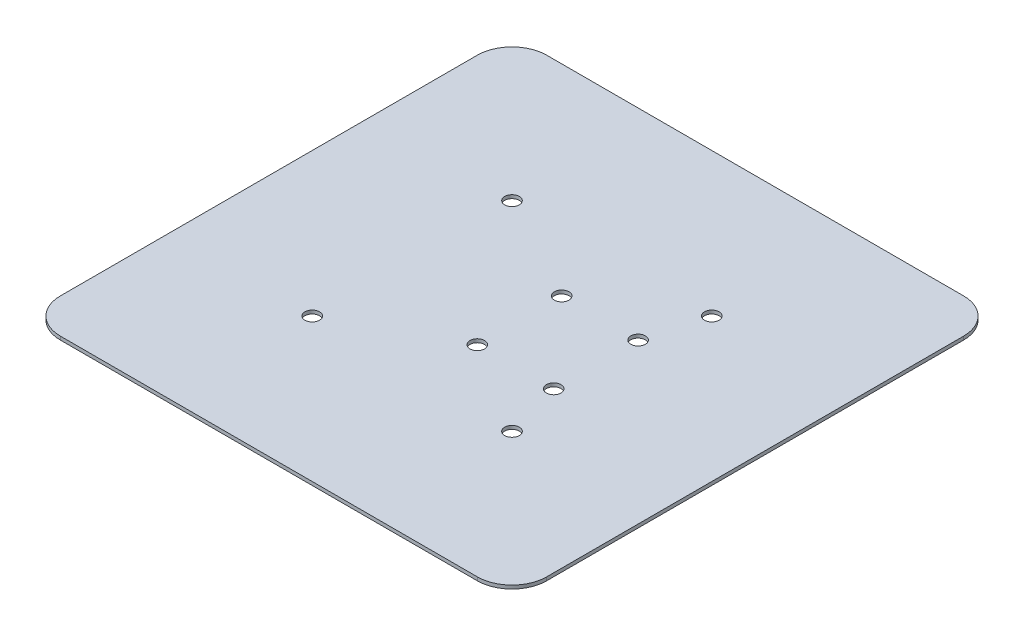
ISO-10303-21;
HEADER;
FILE_DESCRIPTION(('STEP AP214'),'2;1');
FILE_NAME('part.step','',(''),(''),'','','');
FILE_SCHEMA(('AUTOMOTIVE_DESIGN { 1 0 10303 214 1 1 1 1 }'));
ENDSEC;
DATA;
#1=APPLICATION_CONTEXT('core data for automotive mechanical design processes');
#2=APPLICATION_PROTOCOL_DEFINITION('international standard','automotive_design',2000,#1);
#3=PRODUCT_CONTEXT('',#1,'mechanical');
#4=PRODUCT('Part','Part','',(#3));
#5=PRODUCT_RELATED_PRODUCT_CATEGORY('part','',(#4));
#6=PRODUCT_DEFINITION_FORMATION('','',#4);
#7=PRODUCT_DEFINITION_CONTEXT('part definition',#1,'design');
#8=PRODUCT_DEFINITION('design','',#6,#7);
#9=PRODUCT_DEFINITION_SHAPE('','',#8);
#10=(LENGTH_UNIT() NAMED_UNIT(*) SI_UNIT(.MILLI.,.METRE.));
#11=(NAMED_UNIT(*) PLANE_ANGLE_UNIT() SI_UNIT($,.RADIAN.));
#12=(NAMED_UNIT(*) SI_UNIT($,.STERADIAN.) SOLID_ANGLE_UNIT());
#13=UNCERTAINTY_MEASURE_WITH_UNIT(LENGTH_MEASURE(1.E-05),#10,'distance_accuracy_value','');
#14=(GEOMETRIC_REPRESENTATION_CONTEXT(3) GLOBAL_UNCERTAINTY_ASSIGNED_CONTEXT((#13)) GLOBAL_UNIT_ASSIGNED_CONTEXT((#10,
#11,#12)) REPRESENTATION_CONTEXT('',''));
#15=CARTESIAN_POINT('',(0.,0.,0.));
#16=DIRECTION('',(0.,0.,1.));
#17=DIRECTION('',(1.,0.,0.));
#18=AXIS2_PLACEMENT_3D('',#15,#16,#17);
#19=CARTESIAN_POINT('',(0.,1.,0.));
#20=DIRECTION('',(1.,0.,0.));
#21=DIRECTION('',(0.,0.,-1.));
#22=AXIS2_PLACEMENT_3D('',#19,#20,#21);
#23=PLANE('',#22);
#24=DIRECTION('',(0.,0.,1.));
#25=VECTOR('',#24,1.);
#26=CARTESIAN_POINT('',(0.,1.,0.));
#27=LINE('',#26,#25);
#28=CARTESIAN_POINT('',(0.,1.,10.));
#29=VERTEX_POINT('',#28);
#30=CARTESIAN_POINT('',(0.,1.,130.));
#31=VERTEX_POINT('',#30);
#32=EDGE_CURVE('E138',#29,#31,#27,.T.);
#33=ORIENTED_EDGE('',*,*,#32,.F.);
#34=DIRECTION('',(0.,-1.,0.));
#35=VECTOR('',#34,1.);
#36=CARTESIAN_POINT('',(0.,1.,10.));
#37=LINE('',#36,#35);
#38=CARTESIAN_POINT('',(0.,0.,10.));
#39=VERTEX_POINT('',#38);
#40=EDGE_CURVE('E164',#29,#39,#37,.T.);
#41=ORIENTED_EDGE('',*,*,#40,.T.);
#42=DIRECTION('',(0.,0.,1.));
#43=VECTOR('',#42,1.);
#44=CARTESIAN_POINT('',(0.,0.,0.));
#45=LINE('',#44,#43);
#46=CARTESIAN_POINT('',(0.,0.,130.));
#47=VERTEX_POINT('',#46);
#48=EDGE_CURVE('E191',#39,#47,#45,.T.);
#49=ORIENTED_EDGE('',*,*,#48,.T.);
#50=DIRECTION('',(0.,-1.,0.));
#51=VECTOR('',#50,1.);
#52=CARTESIAN_POINT('',(0.,1.,130.));
#53=LINE('',#52,#51);
#54=EDGE_CURVE('E162',#47,#31,#53,.F.);
#55=ORIENTED_EDGE('',*,*,#54,.T.);
#56=EDGE_LOOP('',(#33,#41,#49,#55));
#57=FACE_BOUND('',#56,.T.);
#58=ADVANCED_FACE('F44',(#57),#23,.F.);
#59=CARTESIAN_POINT('',(0.,1.,140.));
#60=DIRECTION('',(0.,0.,-1.));
#61=DIRECTION('',(-1.,0.,0.));
#62=AXIS2_PLACEMENT_3D('',#59,#60,#61);
#63=PLANE('',#62);
#64=DIRECTION('',(1.,0.,0.));
#65=VECTOR('',#64,1.);
#66=CARTESIAN_POINT('',(0.,1.,140.));
#67=LINE('',#66,#65);
#68=CARTESIAN_POINT('',(10.,1.,140.));
#69=VERTEX_POINT('',#68);
#70=CARTESIAN_POINT('',(130.,1.,140.));
#71=VERTEX_POINT('',#70);
#72=EDGE_CURVE('E141',#69,#71,#67,.T.);
#73=ORIENTED_EDGE('',*,*,#72,.F.);
#74=DIRECTION('',(0.,-1.,0.));
#75=VECTOR('',#74,1.);
#76=CARTESIAN_POINT('',(10.,1.,140.));
#77=LINE('',#76,#75);
#78=CARTESIAN_POINT('',(10.,0.,140.));
#79=VERTEX_POINT('',#78);
#80=EDGE_CURVE('E11',#69,#79,#77,.T.);
#81=ORIENTED_EDGE('',*,*,#80,.T.);
#82=DIRECTION('',(1.,0.,0.));
#83=VECTOR('',#82,1.);
#84=CARTESIAN_POINT('',(0.,0.,140.));
#85=LINE('',#84,#83);
#86=CARTESIAN_POINT('',(130.,0.,140.));
#87=VERTEX_POINT('',#86);
#88=EDGE_CURVE('E143',#79,#87,#85,.T.);
#89=ORIENTED_EDGE('',*,*,#88,.T.);
#90=DIRECTION('',(0.,-1.,0.));
#91=VECTOR('',#90,1.);
#92=CARTESIAN_POINT('',(130.,1.,140.));
#93=LINE('',#92,#91);
#94=EDGE_CURVE('E53',#87,#71,#93,.F.);
#95=ORIENTED_EDGE('',*,*,#94,.T.);
#96=EDGE_LOOP('',(#73,#81,#89,#95));
#97=FACE_BOUND('',#96,.T.);
#98=ADVANCED_FACE('F248',(#97),#63,.F.);
#99=CARTESIAN_POINT('',(140.,1.,0.));
#100=DIRECTION('',(-1.,0.,0.));
#101=DIRECTION('',(0.,0.,1.));
#102=AXIS2_PLACEMENT_3D('',#99,#100,#101);
#103=PLANE('',#102);
#104=DIRECTION('',(0.,0.,-1.));
#105=VECTOR('',#104,1.);
#106=CARTESIAN_POINT('',(140.,0.,0.));
#107=LINE('',#106,#105);
#108=CARTESIAN_POINT('',(140.,0.,130.));
#109=VERTEX_POINT('',#108);
#110=CARTESIAN_POINT('',(140.,0.,10.));
#111=VERTEX_POINT('',#110);
#112=EDGE_CURVE('E139',#109,#111,#107,.T.);
#113=ORIENTED_EDGE('',*,*,#112,.T.);
#114=DIRECTION('',(0.,-1.,0.));
#115=VECTOR('',#114,1.);
#116=CARTESIAN_POINT('',(140.,1.,10.));
#117=LINE('',#116,#115);
#118=CARTESIAN_POINT('',(140.,1.,10.));
#119=VERTEX_POINT('',#118);
#120=EDGE_CURVE('E117',#111,#119,#117,.F.);
#121=ORIENTED_EDGE('',*,*,#120,.T.);
#122=DIRECTION('',(0.,0.,-1.));
#123=VECTOR('',#122,1.);
#124=CARTESIAN_POINT('',(140.,1.,0.));
#125=LINE('',#124,#123);
#126=CARTESIAN_POINT('',(140.,1.,130.));
#127=VERTEX_POINT('',#126);
#128=EDGE_CURVE('E200',#127,#119,#125,.T.);
#129=ORIENTED_EDGE('',*,*,#128,.F.);
#130=DIRECTION('',(0.,-1.,0.));
#131=VECTOR('',#130,1.);
#132=CARTESIAN_POINT('',(140.,1.,130.));
#133=LINE('',#132,#131);
#134=EDGE_CURVE('E122',#127,#109,#133,.T.);
#135=ORIENTED_EDGE('',*,*,#134,.T.);
#136=EDGE_LOOP('',(#113,#121,#129,#135));
#137=FACE_BOUND('',#136,.T.);
#138=ADVANCED_FACE('F245',(#137),#103,.F.);
#139=CARTESIAN_POINT('',(0.,1.,0.));
#140=DIRECTION('',(0.,0.,1.));
#141=DIRECTION('',(1.,0.,0.));
#142=AXIS2_PLACEMENT_3D('',#139,#140,#141);
#143=PLANE('',#142);
#144=DIRECTION('',(-1.,0.,0.));
#145=VECTOR('',#144,1.);
#146=CARTESIAN_POINT('',(0.,1.,0.));
#147=LINE('',#146,#145);
#148=CARTESIAN_POINT('',(130.,1.,0.));
#149=VERTEX_POINT('',#148);
#150=CARTESIAN_POINT('',(10.,1.,0.));
#151=VERTEX_POINT('',#150);
#152=EDGE_CURVE('E132',#149,#151,#147,.T.);
#153=ORIENTED_EDGE('',*,*,#152,.F.);
#154=DIRECTION('',(0.,-1.,0.));
#155=VECTOR('',#154,1.);
#156=CARTESIAN_POINT('',(130.,1.,0.));
#157=LINE('',#156,#155);
#158=CARTESIAN_POINT('',(130.,0.,0.));
#159=VERTEX_POINT('',#158);
#160=EDGE_CURVE('E116',#149,#159,#157,.T.);
#161=ORIENTED_EDGE('',*,*,#160,.T.);
#162=DIRECTION('',(-1.,0.,0.));
#163=VECTOR('',#162,1.);
#164=CARTESIAN_POINT('',(0.,0.,0.));
#165=LINE('',#164,#163);
#166=CARTESIAN_POINT('',(10.,0.,0.));
#167=VERTEX_POINT('',#166);
#168=EDGE_CURVE('E129',#159,#167,#165,.T.);
#169=ORIENTED_EDGE('',*,*,#168,.T.);
#170=DIRECTION('',(0.,-1.,0.));
#171=VECTOR('',#170,1.);
#172=CARTESIAN_POINT('',(10.,1.,0.));
#173=LINE('',#172,#171);
#174=EDGE_CURVE('E134',#167,#151,#173,.F.);
#175=ORIENTED_EDGE('',*,*,#174,.T.);
#176=EDGE_LOOP('',(#153,#161,#169,#175));
#177=FACE_BOUND('',#176,.T.);
#178=ADVANCED_FACE('F128',(#177),#143,.F.);
#179=CARTESIAN_POINT('',(0.,1.,0.));
#180=DIRECTION('',(0.,1.,0.));
#181=DIRECTION('',(0.,0.,1.));
#182=AXIS2_PLACEMENT_3D('',#179,#180,#181);
#183=PLANE('',#182);
#184=CARTESIAN_POINT('',(41.25,1.,98.75));
#185=DIRECTION('',(0.,1.,0.));
#186=DIRECTION('',(0.,0.,1.));
#187=AXIS2_PLACEMENT_3D('',#184,#185,#186);
#188=CIRCLE('',#187,2.1);
#189=CARTESIAN_POINT('',(41.25,1.,100.85));
#190=VERTEX_POINT('',#189);
#191=EDGE_CURVE('E206',#190,#190,#188,.T.);
#192=ORIENTED_EDGE('',*,*,#191,.F.);
#193=EDGE_LOOP('',(#192));
#194=FACE_BOUND('',#193,.T.);
#195=CARTESIAN_POINT('',(41.25,1.,41.25));
#196=DIRECTION('',(0.,1.,0.));
#197=DIRECTION('',(0.,0.,1.));
#198=AXIS2_PLACEMENT_3D('',#195,#196,#197);
#199=CIRCLE('',#198,2.1);
#200=CARTESIAN_POINT('',(41.25,1.,43.35));
#201=VERTEX_POINT('',#200);
#202=EDGE_CURVE('E214',#201,#201,#199,.T.);
#203=ORIENTED_EDGE('',*,*,#202,.F.);
#204=EDGE_LOOP('',(#203));
#205=FACE_BOUND('',#204,.T.);
#206=CARTESIAN_POINT('',(98.75,1.,41.25));
#207=DIRECTION('',(0.,1.,0.));
#208=DIRECTION('',(0.,0.,1.));
#209=AXIS2_PLACEMENT_3D('',#206,#207,#208);
#210=CIRCLE('',#209,2.1);
#211=CARTESIAN_POINT('',(98.75,1.,43.35));
#212=VERTEX_POINT('',#211);
#213=EDGE_CURVE('E210',#212,#212,#210,.T.);
#214=ORIENTED_EDGE('',*,*,#213,.F.);
#215=EDGE_LOOP('',(#214));
#216=FACE_BOUND('',#215,.T.);
#217=CARTESIAN_POINT('',(94.15,1.,57.85));
#218=DIRECTION('',(0.,1.,0.));
#219=DIRECTION('',(0.,0.,1.));
#220=AXIS2_PLACEMENT_3D('',#217,#218,#219);
#221=CIRCLE('',#220,2.1);
#222=CARTESIAN_POINT('',(94.15,1.,59.95));
#223=VERTEX_POINT('',#222);
#224=EDGE_CURVE('E207',#223,#223,#221,.T.);
#225=ORIENTED_EDGE('',*,*,#224,.F.);
#226=EDGE_LOOP('',(#225));
#227=FACE_BOUND('',#226,.T.);
#228=CARTESIAN_POINT('',(72.15,1.,82.15));
#229=DIRECTION('',(0.,1.,0.));
#230=DIRECTION('',(0.,0.,1.));
#231=AXIS2_PLACEMENT_3D('',#228,#229,#230);
#232=CIRCLE('',#231,2.1);
#233=CARTESIAN_POINT('',(72.15,1.,84.25));
#234=VERTEX_POINT('',#233);
#235=EDGE_CURVE('E211',#234,#234,#232,.T.);
#236=ORIENTED_EDGE('',*,*,#235,.F.);
#237=EDGE_LOOP('',(#236));
#238=FACE_BOUND('',#237,.T.);
#239=CARTESIAN_POINT('',(72.15,1.,57.85));
#240=DIRECTION('',(0.,1.,0.));
#241=DIRECTION('',(0.,0.,1.));
#242=AXIS2_PLACEMENT_3D('',#239,#240,#241);
#243=CIRCLE('',#242,2.09999999999999);
#244=CARTESIAN_POINT('',(72.15,1.,59.95));
#245=VERTEX_POINT('',#244);
#246=EDGE_CURVE('E222',#245,#245,#243,.T.);
#247=ORIENTED_EDGE('',*,*,#246,.F.);
#248=EDGE_LOOP('',(#247));
#249=FACE_BOUND('',#248,.T.);
#250=CARTESIAN_POINT('',(94.15,1.,82.15));
#251=DIRECTION('',(0.,1.,0.));
#252=DIRECTION('',(0.,0.,1.));
#253=AXIS2_PLACEMENT_3D('',#250,#251,#252);
#254=CIRCLE('',#253,2.1);
#255=CARTESIAN_POINT('',(94.15,1.,84.25));
#256=VERTEX_POINT('',#255);
#257=EDGE_CURVE('E219',#256,#256,#254,.T.);
#258=ORIENTED_EDGE('',*,*,#257,.F.);
#259=EDGE_LOOP('',(#258));
#260=FACE_BOUND('',#259,.T.);
#261=CARTESIAN_POINT('',(98.75,1.,98.75));
#262=DIRECTION('',(0.,1.,0.));
#263=DIRECTION('',(0.,0.,1.));
#264=AXIS2_PLACEMENT_3D('',#261,#262,#263);
#265=CIRCLE('',#264,2.1);
#266=CARTESIAN_POINT('',(98.75,1.,100.85));
#267=VERTEX_POINT('',#266);
#268=EDGE_CURVE('E172',#267,#267,#265,.T.);
#269=ORIENTED_EDGE('',*,*,#268,.F.);
#270=EDGE_LOOP('',(#269));
#271=FACE_BOUND('',#270,.T.);
#272=ORIENTED_EDGE('',*,*,#128,.T.);
#273=CARTESIAN_POINT('',(130.,1.,10.));
#274=DIRECTION('',(0.,1.,0.));
#275=DIRECTION('',(0.,0.,1.));
#276=AXIS2_PLACEMENT_3D('',#273,#274,#275);
#277=CIRCLE('',#276,10.);
#278=EDGE_CURVE('E160',#119,#149,#277,.T.);
#279=ORIENTED_EDGE('',*,*,#278,.T.);
#280=ORIENTED_EDGE('',*,*,#152,.T.);
#281=CARTESIAN_POINT('',(10.,1.,10.));
#282=DIRECTION('',(0.,1.,0.));
#283=DIRECTION('',(0.,0.,1.));
#284=AXIS2_PLACEMENT_3D('',#281,#282,#283);
#285=CIRCLE('',#284,10.);
#286=EDGE_CURVE('E158',#151,#29,#285,.T.);
#287=ORIENTED_EDGE('',*,*,#286,.T.);
#288=ORIENTED_EDGE('',*,*,#32,.T.);
#289=CARTESIAN_POINT('',(10.,1.,130.));
#290=DIRECTION('',(0.,1.,0.));
#291=DIRECTION('',(0.,0.,1.));
#292=AXIS2_PLACEMENT_3D('',#289,#290,#291);
#293=CIRCLE('',#292,10.);
#294=EDGE_CURVE('E67',#31,#69,#293,.T.);
#295=ORIENTED_EDGE('',*,*,#294,.T.);
#296=ORIENTED_EDGE('',*,*,#72,.T.);
#297=CARTESIAN_POINT('',(130.,1.,130.));
#298=DIRECTION('',(0.,1.,0.));
#299=DIRECTION('',(0.,0.,1.));
#300=AXIS2_PLACEMENT_3D('',#297,#298,#299);
#301=CIRCLE('',#300,10.);
#302=EDGE_CURVE('E155',#71,#127,#301,.T.);
#303=ORIENTED_EDGE('',*,*,#302,.T.);
#304=EDGE_LOOP('',(#272,#279,#280,#287,#288,#295,#296,#303));
#305=FACE_BOUND('',#304,.T.);
#306=ADVANCED_FACE('F231',(#194,#205,#216,#227,#238,#249,#260,#271,#305),#183,.T.);
#307=CARTESIAN_POINT('',(0.,0.,0.));
#308=DIRECTION('',(0.,1.,0.));
#309=DIRECTION('',(0.,0.,1.));
#310=AXIS2_PLACEMENT_3D('',#307,#308,#309);
#311=PLANE('',#310);
#312=CARTESIAN_POINT('',(41.25,0.,98.75));
#313=DIRECTION('',(0.,1.,0.));
#314=DIRECTION('',(0.,0.,1.));
#315=AXIS2_PLACEMENT_3D('',#312,#313,#314);
#316=CIRCLE('',#315,2.1);
#317=CARTESIAN_POINT('',(41.25,0.,100.85));
#318=VERTEX_POINT('',#317);
#319=EDGE_CURVE('E48',#318,#318,#316,.T.);
#320=ORIENTED_EDGE('',*,*,#319,.T.);
#321=EDGE_LOOP('',(#320));
#322=FACE_BOUND('',#321,.T.);
#323=CARTESIAN_POINT('',(41.25,0.,41.25));
#324=DIRECTION('',(0.,1.,0.));
#325=DIRECTION('',(0.,0.,1.));
#326=AXIS2_PLACEMENT_3D('',#323,#324,#325);
#327=CIRCLE('',#326,2.1);
#328=CARTESIAN_POINT('',(41.25,0.,43.35));
#329=VERTEX_POINT('',#328);
#330=EDGE_CURVE('E186',#329,#329,#327,.T.);
#331=ORIENTED_EDGE('',*,*,#330,.T.);
#332=EDGE_LOOP('',(#331));
#333=FACE_BOUND('',#332,.T.);
#334=CARTESIAN_POINT('',(98.75,0.,41.25));
#335=DIRECTION('',(0.,1.,0.));
#336=DIRECTION('',(0.,0.,1.));
#337=AXIS2_PLACEMENT_3D('',#334,#335,#336);
#338=CIRCLE('',#337,2.1);
#339=CARTESIAN_POINT('',(98.75,0.,43.35));
#340=VERTEX_POINT('',#339);
#341=EDGE_CURVE('E184',#340,#340,#338,.T.);
#342=ORIENTED_EDGE('',*,*,#341,.T.);
#343=EDGE_LOOP('',(#342));
#344=FACE_BOUND('',#343,.T.);
#345=CARTESIAN_POINT('',(94.15,0.,57.85));
#346=DIRECTION('',(0.,1.,0.));
#347=DIRECTION('',(0.,0.,1.));
#348=AXIS2_PLACEMENT_3D('',#345,#346,#347);
#349=CIRCLE('',#348,2.1);
#350=CARTESIAN_POINT('',(94.15,0.,59.95));
#351=VERTEX_POINT('',#350);
#352=EDGE_CURVE('E181',#351,#351,#349,.T.);
#353=ORIENTED_EDGE('',*,*,#352,.T.);
#354=EDGE_LOOP('',(#353));
#355=FACE_BOUND('',#354,.T.);
#356=CARTESIAN_POINT('',(72.15,0.,82.15));
#357=DIRECTION('',(0.,1.,0.));
#358=DIRECTION('',(0.,0.,1.));
#359=AXIS2_PLACEMENT_3D('',#356,#357,#358);
#360=CIRCLE('',#359,2.1);
#361=CARTESIAN_POINT('',(72.15,0.,84.25));
#362=VERTEX_POINT('',#361);
#363=EDGE_CURVE('E178',#362,#362,#360,.T.);
#364=ORIENTED_EDGE('',*,*,#363,.T.);
#365=EDGE_LOOP('',(#364));
#366=FACE_BOUND('',#365,.T.);
#367=CARTESIAN_POINT('',(72.15,0.,57.85));
#368=DIRECTION('',(0.,1.,0.));
#369=DIRECTION('',(0.,0.,1.));
#370=AXIS2_PLACEMENT_3D('',#367,#368,#369);
#371=CIRCLE('',#370,2.09999999999999);
#372=CARTESIAN_POINT('',(72.15,0.,59.95));
#373=VERTEX_POINT('',#372);
#374=EDGE_CURVE('E175',#373,#373,#371,.T.);
#375=ORIENTED_EDGE('',*,*,#374,.T.);
#376=EDGE_LOOP('',(#375));
#377=FACE_BOUND('',#376,.T.);
#378=CARTESIAN_POINT('',(94.15,0.,82.15));
#379=DIRECTION('',(0.,1.,0.));
#380=DIRECTION('',(0.,0.,1.));
#381=AXIS2_PLACEMENT_3D('',#378,#379,#380);
#382=CIRCLE('',#381,2.1);
#383=CARTESIAN_POINT('',(94.15,0.,84.25));
#384=VERTEX_POINT('',#383);
#385=EDGE_CURVE('E171',#384,#384,#382,.T.);
#386=ORIENTED_EDGE('',*,*,#385,.T.);
#387=EDGE_LOOP('',(#386));
#388=FACE_BOUND('',#387,.T.);
#389=CARTESIAN_POINT('',(98.75,0.,98.75));
#390=DIRECTION('',(0.,1.,0.));
#391=DIRECTION('',(0.,0.,1.));
#392=AXIS2_PLACEMENT_3D('',#389,#390,#391);
#393=CIRCLE('',#392,2.1);
#394=CARTESIAN_POINT('',(98.75,0.,100.85));
#395=VERTEX_POINT('',#394);
#396=EDGE_CURVE('E168',#395,#395,#393,.T.);
#397=ORIENTED_EDGE('',*,*,#396,.T.);
#398=EDGE_LOOP('',(#397));
#399=FACE_BOUND('',#398,.T.);
#400=ORIENTED_EDGE('',*,*,#168,.F.);
#401=CARTESIAN_POINT('',(130.,0.,10.));
#402=DIRECTION('',(0.,1.,0.));
#403=DIRECTION('',(0.,0.,1.));
#404=AXIS2_PLACEMENT_3D('',#401,#402,#403);
#405=CIRCLE('',#404,10.);
#406=EDGE_CURVE('E112',#159,#111,#405,.F.);
#407=ORIENTED_EDGE('',*,*,#406,.T.);
#408=ORIENTED_EDGE('',*,*,#112,.F.);
#409=CARTESIAN_POINT('',(130.,0.,130.));
#410=DIRECTION('',(0.,1.,0.));
#411=DIRECTION('',(0.,0.,1.));
#412=AXIS2_PLACEMENT_3D('',#409,#410,#411);
#413=CIRCLE('',#412,10.);
#414=EDGE_CURVE('E133',#109,#87,#413,.F.);
#415=ORIENTED_EDGE('',*,*,#414,.T.);
#416=ORIENTED_EDGE('',*,*,#88,.F.);
#417=CARTESIAN_POINT('',(10.,0.,130.));
#418=DIRECTION('',(0.,1.,0.));
#419=DIRECTION('',(0.,0.,1.));
#420=AXIS2_PLACEMENT_3D('',#417,#418,#419);
#421=CIRCLE('',#420,10.);
#422=EDGE_CURVE('E149',#79,#47,#421,.F.);
#423=ORIENTED_EDGE('',*,*,#422,.T.);
#424=ORIENTED_EDGE('',*,*,#48,.F.);
#425=CARTESIAN_POINT('',(10.,0.,10.));
#426=DIRECTION('',(0.,1.,0.));
#427=DIRECTION('',(0.,0.,1.));
#428=AXIS2_PLACEMENT_3D('',#425,#426,#427);
#429=CIRCLE('',#428,10.);
#430=EDGE_CURVE('E123',#39,#167,#429,.F.);
#431=ORIENTED_EDGE('',*,*,#430,.T.);
#432=EDGE_LOOP('',(#400,#407,#408,#415,#416,#423,#424,#431));
#433=FACE_BOUND('',#432,.T.);
#434=ADVANCED_FACE('F136',(#322,#333,#344,#355,#366,#377,#388,#399,#433),#311,.F.);
#435=CARTESIAN_POINT('',(130.,1.,10.));
#436=DIRECTION('',(0.,-1.,0.));
#437=DIRECTION('',(0.,0.,-1.));
#438=AXIS2_PLACEMENT_3D('',#435,#436,#437);
#439=CYLINDRICAL_SURFACE('',#438,10.);
#440=ORIENTED_EDGE('',*,*,#278,.F.);
#441=ORIENTED_EDGE('',*,*,#120,.F.);
#442=ORIENTED_EDGE('',*,*,#406,.F.);
#443=ORIENTED_EDGE('',*,*,#160,.F.);
#444=EDGE_LOOP('',(#440,#441,#442,#443));
#445=FACE_BOUND('',#444,.T.);
#446=ADVANCED_FACE('F115',(#445),#439,.T.);
#447=CARTESIAN_POINT('',(10.,1.,10.));
#448=DIRECTION('',(0.,-1.,0.));
#449=DIRECTION('',(0.,0.,-1.));
#450=AXIS2_PLACEMENT_3D('',#447,#448,#449);
#451=CYLINDRICAL_SURFACE('',#450,10.);
#452=ORIENTED_EDGE('',*,*,#286,.F.);
#453=ORIENTED_EDGE('',*,*,#174,.F.);
#454=ORIENTED_EDGE('',*,*,#430,.F.);
#455=ORIENTED_EDGE('',*,*,#40,.F.);
#456=EDGE_LOOP('',(#452,#453,#454,#455));
#457=FACE_BOUND('',#456,.T.);
#458=ADVANCED_FACE('F256',(#457),#451,.T.);
#459=CARTESIAN_POINT('',(10.,1.,130.));
#460=DIRECTION('',(0.,-1.,0.));
#461=DIRECTION('',(0.,0.,-1.));
#462=AXIS2_PLACEMENT_3D('',#459,#460,#461);
#463=CYLINDRICAL_SURFACE('',#462,10.);
#464=ORIENTED_EDGE('',*,*,#294,.F.);
#465=ORIENTED_EDGE('',*,*,#54,.F.);
#466=ORIENTED_EDGE('',*,*,#422,.F.);
#467=ORIENTED_EDGE('',*,*,#80,.F.);
#468=EDGE_LOOP('',(#464,#465,#466,#467));
#469=FACE_BOUND('',#468,.T.);
#470=ADVANCED_FACE('F251',(#469),#463,.T.);
#471=CARTESIAN_POINT('',(130.,1.,130.));
#472=DIRECTION('',(0.,-1.,0.));
#473=DIRECTION('',(0.,0.,-1.));
#474=AXIS2_PLACEMENT_3D('',#471,#472,#473);
#475=CYLINDRICAL_SURFACE('',#474,10.);
#476=ORIENTED_EDGE('',*,*,#302,.F.);
#477=ORIENTED_EDGE('',*,*,#94,.F.);
#478=ORIENTED_EDGE('',*,*,#414,.F.);
#479=ORIENTED_EDGE('',*,*,#134,.F.);
#480=EDGE_LOOP('',(#476,#477,#478,#479));
#481=FACE_BOUND('',#480,.T.);
#482=ADVANCED_FACE('F46',(#481),#475,.T.);
#483=CARTESIAN_POINT('',(98.75,-9.,98.75));
#484=DIRECTION('',(0.,1.,0.));
#485=DIRECTION('',(0.,0.,1.));
#486=AXIS2_PLACEMENT_3D('',#483,#484,#485);
#487=CYLINDRICAL_SURFACE('',#486,2.1);
#488=ORIENTED_EDGE('',*,*,#268,.T.);
#489=EDGE_LOOP('',(#488));
#490=FACE_BOUND('',#489,.T.);
#491=ORIENTED_EDGE('',*,*,#396,.F.);
#492=EDGE_LOOP('',(#491));
#493=FACE_BOUND('',#492,.T.);
#494=ADVANCED_FACE('F277',(#490,#493),#487,.F.);
#495=CARTESIAN_POINT('',(94.15,-9.,82.15));
#496=DIRECTION('',(0.,1.,0.));
#497=DIRECTION('',(0.,0.,1.));
#498=AXIS2_PLACEMENT_3D('',#495,#496,#497);
#499=CYLINDRICAL_SURFACE('',#498,2.1);
#500=ORIENTED_EDGE('',*,*,#257,.T.);
#501=EDGE_LOOP('',(#500));
#502=FACE_BOUND('',#501,.T.);
#503=ORIENTED_EDGE('',*,*,#385,.F.);
#504=EDGE_LOOP('',(#503));
#505=FACE_BOUND('',#504,.T.);
#506=ADVANCED_FACE('F280',(#502,#505),#499,.F.);
#507=CARTESIAN_POINT('',(72.15,-9.,57.85));
#508=DIRECTION('',(0.,1.,0.));
#509=DIRECTION('',(0.,0.,1.));
#510=AXIS2_PLACEMENT_3D('',#507,#508,#509);
#511=CYLINDRICAL_SURFACE('',#510,2.09999999999999);
#512=ORIENTED_EDGE('',*,*,#246,.T.);
#513=EDGE_LOOP('',(#512));
#514=FACE_BOUND('',#513,.T.);
#515=ORIENTED_EDGE('',*,*,#374,.F.);
#516=EDGE_LOOP('',(#515));
#517=FACE_BOUND('',#516,.T.);
#518=ADVANCED_FACE('F300',(#514,#517),#511,.F.);
#519=CARTESIAN_POINT('',(72.15,-9.,82.15));
#520=DIRECTION('',(0.,1.,0.));
#521=DIRECTION('',(0.,0.,1.));
#522=AXIS2_PLACEMENT_3D('',#519,#520,#521);
#523=CYLINDRICAL_SURFACE('',#522,2.1);
#524=ORIENTED_EDGE('',*,*,#235,.T.);
#525=EDGE_LOOP('',(#524));
#526=FACE_BOUND('',#525,.T.);
#527=ORIENTED_EDGE('',*,*,#363,.F.);
#528=EDGE_LOOP('',(#527));
#529=FACE_BOUND('',#528,.T.);
#530=ADVANCED_FACE('F228',(#526,#529),#523,.F.);
#531=CARTESIAN_POINT('',(94.15,-9.,57.85));
#532=DIRECTION('',(0.,1.,0.));
#533=DIRECTION('',(0.,0.,1.));
#534=AXIS2_PLACEMENT_3D('',#531,#532,#533);
#535=CYLINDRICAL_SURFACE('',#534,2.1);
#536=ORIENTED_EDGE('',*,*,#224,.T.);
#537=EDGE_LOOP('',(#536));
#538=FACE_BOUND('',#537,.T.);
#539=ORIENTED_EDGE('',*,*,#352,.F.);
#540=EDGE_LOOP('',(#539));
#541=FACE_BOUND('',#540,.T.);
#542=ADVANCED_FACE('F282',(#538,#541),#535,.F.);
#543=CARTESIAN_POINT('',(98.75,-9.,41.25));
#544=DIRECTION('',(0.,1.,0.));
#545=DIRECTION('',(0.,0.,1.));
#546=AXIS2_PLACEMENT_3D('',#543,#544,#545);
#547=CYLINDRICAL_SURFACE('',#546,2.1);
#548=ORIENTED_EDGE('',*,*,#213,.T.);
#549=EDGE_LOOP('',(#548));
#550=FACE_BOUND('',#549,.T.);
#551=ORIENTED_EDGE('',*,*,#341,.F.);
#552=EDGE_LOOP('',(#551));
#553=FACE_BOUND('',#552,.T.);
#554=ADVANCED_FACE('F285',(#550,#553),#547,.F.);
#555=CARTESIAN_POINT('',(41.25,-9.,41.25));
#556=DIRECTION('',(0.,1.,0.));
#557=DIRECTION('',(0.,0.,1.));
#558=AXIS2_PLACEMENT_3D('',#555,#556,#557);
#559=CYLINDRICAL_SURFACE('',#558,2.1);
#560=ORIENTED_EDGE('',*,*,#202,.T.);
#561=EDGE_LOOP('',(#560));
#562=FACE_BOUND('',#561,.T.);
#563=ORIENTED_EDGE('',*,*,#330,.F.);
#564=EDGE_LOOP('',(#563));
#565=FACE_BOUND('',#564,.T.);
#566=ADVANCED_FACE('F289',(#562,#565),#559,.F.);
#567=CARTESIAN_POINT('',(41.25,-9.,98.75));
#568=DIRECTION('',(0.,1.,0.));
#569=DIRECTION('',(0.,0.,1.));
#570=AXIS2_PLACEMENT_3D('',#567,#568,#569);
#571=CYLINDRICAL_SURFACE('',#570,2.1);
#572=ORIENTED_EDGE('',*,*,#191,.T.);
#573=EDGE_LOOP('',(#572));
#574=FACE_BOUND('',#573,.T.);
#575=ORIENTED_EDGE('',*,*,#319,.F.);
#576=EDGE_LOOP('',(#575));
#577=FACE_BOUND('',#576,.T.);
#578=ADVANCED_FACE('F293',(#574,#577),#571,.F.);
#579=CLOSED_SHELL('',(#58,#98,#138,#178,#306,#434,#446,#458,#470,#482,#494,#506,#518,#530,#542,
#554,#566,#578));
#580=MANIFOLD_SOLID_BREP('B2',#579);
#581=ADVANCED_BREP_SHAPE_REPRESENTATION('',(#18,#580),#14);
#582=SHAPE_DEFINITION_REPRESENTATION(#9,#581);
ENDSEC;
END-ISO-10303-21;
